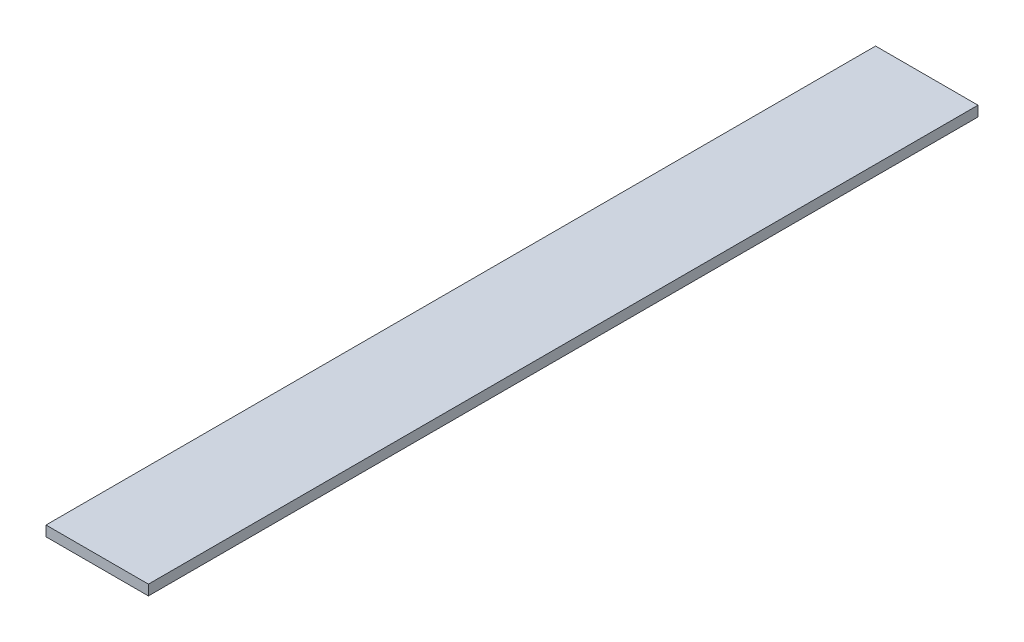
ISO-10303-21;
HEADER;
FILE_DESCRIPTION(('STEP AP214'),'2;1');
FILE_NAME('part.step','',(''),(''),'','','');
FILE_SCHEMA(('AUTOMOTIVE_DESIGN { 1 0 10303 214 1 1 1 1 }'));
ENDSEC;
DATA;
#1=APPLICATION_CONTEXT('core data for automotive mechanical design processes');
#2=APPLICATION_PROTOCOL_DEFINITION('international standard','automotive_design',2000,#1);
#3=PRODUCT_CONTEXT('',#1,'mechanical');
#4=PRODUCT('Part','Part','',(#3));
#5=PRODUCT_RELATED_PRODUCT_CATEGORY('part','',(#4));
#6=PRODUCT_DEFINITION_FORMATION('','',#4);
#7=PRODUCT_DEFINITION_CONTEXT('part definition',#1,'design');
#8=PRODUCT_DEFINITION('design','',#6,#7);
#9=PRODUCT_DEFINITION_SHAPE('','',#8);
#10=(LENGTH_UNIT() NAMED_UNIT(*) SI_UNIT(.MILLI.,.METRE.));
#11=(NAMED_UNIT(*) PLANE_ANGLE_UNIT() SI_UNIT($,.RADIAN.));
#12=(NAMED_UNIT(*) SI_UNIT($,.STERADIAN.) SOLID_ANGLE_UNIT());
#13=UNCERTAINTY_MEASURE_WITH_UNIT(LENGTH_MEASURE(1.E-05),#10,'distance_accuracy_value','');
#14=(GEOMETRIC_REPRESENTATION_CONTEXT(3) GLOBAL_UNCERTAINTY_ASSIGNED_CONTEXT((#13)) GLOBAL_UNIT_ASSIGNED_CONTEXT((#10,
#11,#12)) REPRESENTATION_CONTEXT('',''));
#15=CARTESIAN_POINT('',(0.,0.,0.));
#16=DIRECTION('',(0.,0.,1.));
#17=DIRECTION('',(1.,0.,0.));
#18=AXIS2_PLACEMENT_3D('',#15,#16,#17);
#19=CARTESIAN_POINT('',(25.,5.,202.5));
#20=DIRECTION('',(-1.,0.,0.));
#21=DIRECTION('',(0.,0.,1.));
#22=AXIS2_PLACEMENT_3D('',#19,#20,#21);
#23=PLANE('',#22);
#24=DIRECTION('',(0.,0.,-1.));
#25=VECTOR('',#24,1.);
#26=CARTESIAN_POINT('',(25.,0.,202.5));
#27=LINE('',#26,#25);
#28=CARTESIAN_POINT('',(25.,0.,202.5));
#29=VERTEX_POINT('',#28);
#30=CARTESIAN_POINT('',(25.,0.,-202.5));
#31=VERTEX_POINT('',#30);
#32=EDGE_CURVE('E94',#29,#31,#27,.T.);
#33=ORIENTED_EDGE('',*,*,#32,.T.);
#34=DIRECTION('',(0.,-1.,0.));
#35=VECTOR('',#34,1.);
#36=CARTESIAN_POINT('',(25.,5.,-202.5));
#37=LINE('',#36,#35);
#38=CARTESIAN_POINT('',(25.,5.,-202.5));
#39=VERTEX_POINT('',#38);
#40=EDGE_CURVE('E11',#39,#31,#37,.T.);
#41=ORIENTED_EDGE('',*,*,#40,.F.);
#42=DIRECTION('',(0.,0.,-1.));
#43=VECTOR('',#42,1.);
#44=CARTESIAN_POINT('',(25.,5.,202.5));
#45=LINE('',#44,#43);
#46=CARTESIAN_POINT('',(25.,5.,202.5));
#47=VERTEX_POINT('',#46);
#48=EDGE_CURVE('E82',#47,#39,#45,.T.);
#49=ORIENTED_EDGE('',*,*,#48,.F.);
#50=DIRECTION('',(0.,-1.,0.));
#51=VECTOR('',#50,1.);
#52=CARTESIAN_POINT('',(25.,5.,202.5));
#53=LINE('',#52,#51);
#54=EDGE_CURVE('E90',#47,#29,#53,.T.);
#55=ORIENTED_EDGE('',*,*,#54,.T.);
#56=EDGE_LOOP('',(#33,#41,#49,#55));
#57=FACE_BOUND('',#56,.T.);
#58=ADVANCED_FACE('F31',(#57),#23,.F.);
#59=CARTESIAN_POINT('',(-25.,5.,-202.5));
#60=DIRECTION('',(0.,0.,1.));
#61=DIRECTION('',(1.,0.,0.));
#62=AXIS2_PLACEMENT_3D('',#59,#60,#61);
#63=PLANE('',#62);
#64=DIRECTION('',(-1.,0.,0.));
#65=VECTOR('',#64,1.);
#66=CARTESIAN_POINT('',(-25.,0.,-202.5));
#67=LINE('',#66,#65);
#68=CARTESIAN_POINT('',(-25.,0.,-202.5));
#69=VERTEX_POINT('',#68);
#70=EDGE_CURVE('E86',#31,#69,#67,.T.);
#71=ORIENTED_EDGE('',*,*,#70,.T.);
#72=DIRECTION('',(0.,-1.,0.));
#73=VECTOR('',#72,1.);
#74=CARTESIAN_POINT('',(-25.,5.,-202.5));
#75=LINE('',#74,#73);
#76=CARTESIAN_POINT('',(-25.,5.,-202.5));
#77=VERTEX_POINT('',#76);
#78=EDGE_CURVE('E39',#77,#69,#75,.T.);
#79=ORIENTED_EDGE('',*,*,#78,.F.);
#80=DIRECTION('',(-1.,0.,0.));
#81=VECTOR('',#80,1.);
#82=CARTESIAN_POINT('',(-25.,5.,-202.5));
#83=LINE('',#82,#81);
#84=EDGE_CURVE('E77',#39,#77,#83,.T.);
#85=ORIENTED_EDGE('',*,*,#84,.F.);
#86=ORIENTED_EDGE('',*,*,#40,.T.);
#87=EDGE_LOOP('',(#71,#79,#85,#86));
#88=FACE_BOUND('',#87,.T.);
#89=ADVANCED_FACE('F85',(#88),#63,.F.);
#90=CARTESIAN_POINT('',(-25.,5.,202.5));
#91=DIRECTION('',(1.,0.,0.));
#92=DIRECTION('',(0.,0.,-1.));
#93=AXIS2_PLACEMENT_3D('',#90,#91,#92);
#94=PLANE('',#93);
#95=DIRECTION('',(0.,0.,1.));
#96=VECTOR('',#95,1.);
#97=CARTESIAN_POINT('',(-25.,0.,202.5));
#98=LINE('',#97,#96);
#99=CARTESIAN_POINT('',(-25.,0.,202.5));
#100=VERTEX_POINT('',#99);
#101=EDGE_CURVE('E64',#69,#100,#98,.T.);
#102=ORIENTED_EDGE('',*,*,#101,.T.);
#103=DIRECTION('',(0.,-1.,0.));
#104=VECTOR('',#103,1.);
#105=CARTESIAN_POINT('',(-25.,5.,202.5));
#106=LINE('',#105,#104);
#107=CARTESIAN_POINT('',(-25.,5.,202.5));
#108=VERTEX_POINT('',#107);
#109=EDGE_CURVE('E87',#108,#100,#106,.T.);
#110=ORIENTED_EDGE('',*,*,#109,.F.);
#111=DIRECTION('',(0.,0.,1.));
#112=VECTOR('',#111,1.);
#113=CARTESIAN_POINT('',(-25.,5.,202.5));
#114=LINE('',#113,#112);
#115=EDGE_CURVE('E80',#77,#108,#114,.T.);
#116=ORIENTED_EDGE('',*,*,#115,.F.);
#117=ORIENTED_EDGE('',*,*,#78,.T.);
#118=EDGE_LOOP('',(#102,#110,#116,#117));
#119=FACE_BOUND('',#118,.T.);
#120=ADVANCED_FACE('F88',(#119),#94,.F.);
#121=CARTESIAN_POINT('',(-25.,5.,202.5));
#122=DIRECTION('',(0.,0.,-1.));
#123=DIRECTION('',(-1.,0.,0.));
#124=AXIS2_PLACEMENT_3D('',#121,#122,#123);
#125=PLANE('',#124);
#126=DIRECTION('',(1.,0.,0.));
#127=VECTOR('',#126,1.);
#128=CARTESIAN_POINT('',(-25.,0.,202.5));
#129=LINE('',#128,#127);
#130=EDGE_CURVE('E70',#100,#29,#129,.T.);
#131=ORIENTED_EDGE('',*,*,#130,.T.);
#132=ORIENTED_EDGE('',*,*,#54,.F.);
#133=DIRECTION('',(1.,0.,0.));
#134=VECTOR('',#133,1.);
#135=CARTESIAN_POINT('',(-25.,5.,202.5));
#136=LINE('',#135,#134);
#137=EDGE_CURVE('E47',#108,#47,#136,.T.);
#138=ORIENTED_EDGE('',*,*,#137,.F.);
#139=ORIENTED_EDGE('',*,*,#109,.T.);
#140=EDGE_LOOP('',(#131,#132,#138,#139));
#141=FACE_BOUND('',#140,.T.);
#142=ADVANCED_FACE('F101',(#141),#125,.F.);
#143=CARTESIAN_POINT('',(25.,5.,-202.5));
#144=DIRECTION('',(0.,-1.,0.));
#145=DIRECTION('',(0.,0.,-1.));
#146=AXIS2_PLACEMENT_3D('',#143,#144,#145);
#147=PLANE('',#146);
#148=ORIENTED_EDGE('',*,*,#48,.T.);
#149=ORIENTED_EDGE('',*,*,#84,.T.);
#150=ORIENTED_EDGE('',*,*,#115,.T.);
#151=ORIENTED_EDGE('',*,*,#137,.T.);
#152=EDGE_LOOP('',(#148,#149,#150,#151));
#153=FACE_BOUND('',#152,.T.);
#154=ADVANCED_FACE('F78',(#153),#147,.F.);
#155=CARTESIAN_POINT('',(25.,0.,-202.5));
#156=DIRECTION('',(0.,-1.,0.));
#157=DIRECTION('',(0.,0.,-1.));
#158=AXIS2_PLACEMENT_3D('',#155,#156,#157);
#159=PLANE('',#158);
#160=ORIENTED_EDGE('',*,*,#32,.F.);
#161=ORIENTED_EDGE('',*,*,#130,.F.);
#162=ORIENTED_EDGE('',*,*,#101,.F.);
#163=ORIENTED_EDGE('',*,*,#70,.F.);
#164=EDGE_LOOP('',(#160,#161,#162,#163));
#165=FACE_BOUND('',#164,.T.);
#166=ADVANCED_FACE('F104',(#165),#159,.T.);
#167=CLOSED_SHELL('',(#58,#89,#120,#142,#154,#166));
#168=MANIFOLD_SOLID_BREP('B2',#167);
#169=ADVANCED_BREP_SHAPE_REPRESENTATION('',(#18,#168),#14);
#170=SHAPE_DEFINITION_REPRESENTATION(#9,#169);
ENDSEC;
END-ISO-10303-21;
